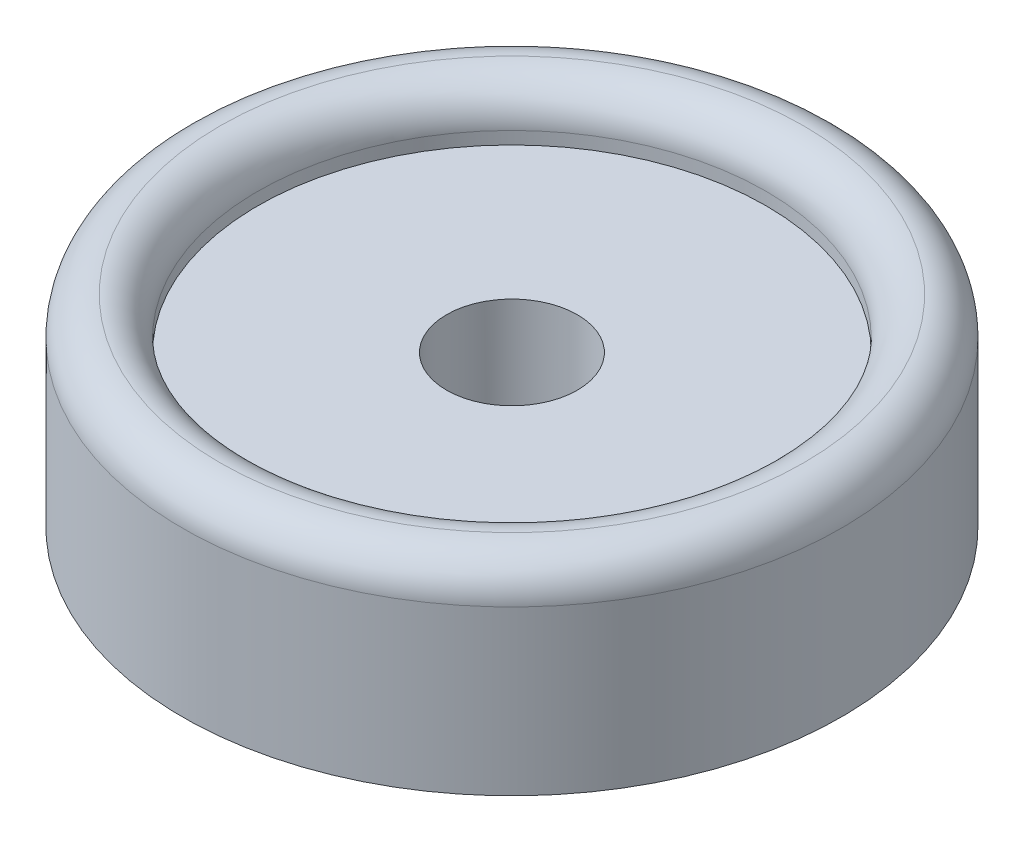
ISO-10303-21;
HEADER;
FILE_DESCRIPTION(('STEP AP214'),'2;1');
FILE_NAME('part.step','',(''),(''),'','','');
FILE_SCHEMA(('AUTOMOTIVE_DESIGN { 1 0 10303 214 1 1 1 1 }'));
ENDSEC;
DATA;
#1=APPLICATION_CONTEXT('core data for automotive mechanical design processes');
#2=APPLICATION_PROTOCOL_DEFINITION('international standard','automotive_design',2000,#1);
#3=PRODUCT_CONTEXT('',#1,'mechanical');
#4=PRODUCT('Part','Part','',(#3));
#5=PRODUCT_RELATED_PRODUCT_CATEGORY('part','',(#4));
#6=PRODUCT_DEFINITION_FORMATION('','',#4);
#7=PRODUCT_DEFINITION_CONTEXT('part definition',#1,'design');
#8=PRODUCT_DEFINITION('design','',#6,#7);
#9=PRODUCT_DEFINITION_SHAPE('','',#8);
#10=(LENGTH_UNIT() NAMED_UNIT(*) SI_UNIT(.MILLI.,.METRE.));
#11=(NAMED_UNIT(*) PLANE_ANGLE_UNIT() SI_UNIT($,.RADIAN.));
#12=(NAMED_UNIT(*) SI_UNIT($,.STERADIAN.) SOLID_ANGLE_UNIT());
#13=UNCERTAINTY_MEASURE_WITH_UNIT(LENGTH_MEASURE(1.E-05),#10,'distance_accuracy_value','');
#14=(GEOMETRIC_REPRESENTATION_CONTEXT(3) GLOBAL_UNCERTAINTY_ASSIGNED_CONTEXT((#13)) GLOBAL_UNIT_ASSIGNED_CONTEXT((#10,
#11,#12)) REPRESENTATION_CONTEXT('',''));
#15=CARTESIAN_POINT('',(0.,0.,0.));
#16=DIRECTION('',(0.,0.,1.));
#17=DIRECTION('',(1.,0.,0.));
#18=AXIS2_PLACEMENT_3D('',#15,#16,#17);
#19=CARTESIAN_POINT('',(0.,-50.,0.));
#20=DIRECTION('',(0.,-1.,0.));
#21=DIRECTION('',(0.,0.,-1.));
#22=AXIS2_PLACEMENT_3D('',#19,#20,#21);
#23=PLANE('',#22);
#24=CARTESIAN_POINT('',(0.,-50.,0.));
#25=DIRECTION('',(0.,-1.,0.));
#26=DIRECTION('',(0.,0.,-1.));
#27=AXIS2_PLACEMENT_3D('',#24,#25,#26);
#28=CIRCLE('',#27,10.1);
#29=CARTESIAN_POINT('',(0.,-50.,-10.1));
#30=VERTEX_POINT('',#29);
#31=EDGE_CURVE('E59',#30,#30,#28,.T.);
#32=ORIENTED_EDGE('',*,*,#31,.F.);
#33=EDGE_LOOP('',(#32));
#34=FACE_BOUND('',#33,.T.);
#35=CARTESIAN_POINT('',(0.,-50.,0.));
#36=DIRECTION('',(0.,-1.,0.));
#37=DIRECTION('',(0.,0.,-1.));
#38=AXIS2_PLACEMENT_3D('',#35,#36,#37);
#39=CIRCLE('',#38,2.6);
#40=CARTESIAN_POINT('',(0.,-50.,-2.6));
#41=VERTEX_POINT('',#40);
#42=EDGE_CURVE('E65',#41,#41,#39,.T.);
#43=ORIENTED_EDGE('',*,*,#42,.T.);
#44=EDGE_LOOP('',(#43));
#45=FACE_BOUND('',#44,.T.);
#46=ADVANCED_FACE('F45',(#34,#45),#23,.F.);
#47=CARTESIAN_POINT('',(0.,-56.,0.));
#48=DIRECTION('',(0.,-1.,0.));
#49=DIRECTION('',(0.,0.,-1.));
#50=AXIS2_PLACEMENT_3D('',#47,#48,#49);
#51=PLANE('',#50);
#52=CARTESIAN_POINT('',(0.,-56.,0.));
#53=DIRECTION('',(0.,1.,0.));
#54=DIRECTION('',(0.,0.,1.));
#55=AXIS2_PLACEMENT_3D('',#52,#53,#54);
#56=CIRCLE('',#55,2.6);
#57=CARTESIAN_POINT('',(0.,-56.,2.6));
#58=VERTEX_POINT('',#57);
#59=EDGE_CURVE('E69',#58,#58,#56,.T.);
#60=ORIENTED_EDGE('',*,*,#59,.T.);
#61=EDGE_LOOP('',(#60));
#62=FACE_BOUND('',#61,.T.);
#63=CARTESIAN_POINT('',(0.,-56.,0.));
#64=DIRECTION('',(0.,-1.,0.));
#65=DIRECTION('',(0.,0.,-1.));
#66=AXIS2_PLACEMENT_3D('',#63,#64,#65);
#67=CIRCLE('',#66,13.1);
#68=CARTESIAN_POINT('',(0.,-56.,-13.1));
#69=VERTEX_POINT('',#68);
#70=EDGE_CURVE('E73',#69,#69,#67,.T.);
#71=ORIENTED_EDGE('',*,*,#70,.T.);
#72=EDGE_LOOP('',(#71));
#73=FACE_BOUND('',#72,.T.);
#74=ADVANCED_FACE('F96',(#62,#73),#51,.T.);
#75=CARTESIAN_POINT('',(0.,-56.,0.));
#76=DIRECTION('',(0.,1.,0.));
#77=DIRECTION('',(0.,0.,1.));
#78=AXIS2_PLACEMENT_3D('',#75,#76,#77);
#79=CYLINDRICAL_SURFACE('',#78,2.6);
#80=ORIENTED_EDGE('',*,*,#59,.F.);
#81=EDGE_LOOP('',(#80));
#82=FACE_BOUND('',#81,.T.);
#83=ORIENTED_EDGE('',*,*,#42,.F.);
#84=EDGE_LOOP('',(#83));
#85=FACE_BOUND('',#84,.T.);
#86=ADVANCED_FACE('F103',(#82,#85),#79,.F.);
#87=CARTESIAN_POINT('',(0.,-48.,0.));
#88=DIRECTION('',(0.,-1.,0.));
#89=DIRECTION('',(0.,0.,-1.));
#90=AXIS2_PLACEMENT_3D('',#87,#88,#89);
#91=CYLINDRICAL_SURFACE('',#90,10.1);
#92=CARTESIAN_POINT('',(0.,-49.5,0.));
#93=DIRECTION('',(0.,-1.,0.));
#94=DIRECTION('',(0.,0.,-1.));
#95=AXIS2_PLACEMENT_3D('',#92,#93,#94);
#96=CIRCLE('',#95,10.1);
#97=CARTESIAN_POINT('',(0.,-49.5,-10.1));
#98=VERTEX_POINT('',#97);
#99=EDGE_CURVE('E10',#98,#98,#96,.F.);
#100=ORIENTED_EDGE('',*,*,#99,.T.);
#101=EDGE_LOOP('',(#100));
#102=FACE_BOUND('',#101,.T.);
#103=ORIENTED_EDGE('',*,*,#31,.T.);
#104=EDGE_LOOP('',(#103));
#105=FACE_BOUND('',#104,.T.);
#106=ADVANCED_FACE('F92',(#102,#105),#91,.F.);
#107=CARTESIAN_POINT('',(0.,-48.,0.));
#108=DIRECTION('',(0.,-1.,0.));
#109=DIRECTION('',(0.,0.,-1.));
#110=AXIS2_PLACEMENT_3D('',#107,#108,#109);
#111=CYLINDRICAL_SURFACE('',#110,13.1);
#112=CARTESIAN_POINT('',(0.,-49.5,0.));
#113=DIRECTION('',(0.,-1.,0.));
#114=DIRECTION('',(0.,0.,-1.));
#115=AXIS2_PLACEMENT_3D('',#112,#113,#114);
#116=CIRCLE('',#115,13.1);
#117=CARTESIAN_POINT('',(0.,-49.5,-13.1));
#118=VERTEX_POINT('',#117);
#119=EDGE_CURVE('E54',#118,#118,#116,.T.);
#120=ORIENTED_EDGE('',*,*,#119,.T.);
#121=EDGE_LOOP('',(#120));
#122=FACE_BOUND('',#121,.T.);
#123=ORIENTED_EDGE('',*,*,#70,.F.);
#124=EDGE_LOOP('',(#123));
#125=FACE_BOUND('',#124,.T.);
#126=ADVANCED_FACE('F86',(#122,#125),#111,.T.);
#127=CARTESIAN_POINT('',(0.,-49.5,0.));
#128=DIRECTION('',(0.,-1.,0.));
#129=DIRECTION('',(0.,0.,-1.));
#130=AXIS2_PLACEMENT_3D('',#127,#128,#129);
#131=TOROIDAL_SURFACE('',#130,11.6,1.5);
#132=ORIENTED_EDGE('',*,*,#99,.F.);
#133=EDGE_LOOP('',(#132));
#134=FACE_BOUND('',#133,.T.);
#135=CARTESIAN_POINT('',(0.,-48.,0.));
#136=DIRECTION('',(0.,-1.,0.));
#137=DIRECTION('',(0.,0.,-1.));
#138=AXIS2_PLACEMENT_3D('',#135,#136,#137);
#139=CIRCLE('',#138,11.6);
#140=CARTESIAN_POINT('',(0.,-48.,-11.6));
#141=VERTEX_POINT('',#140);
#142=EDGE_CURVE('E49',#141,#141,#139,.T.);
#143=ORIENTED_EDGE('',*,*,#142,.F.);
#144=EDGE_LOOP('',(#143));
#145=FACE_BOUND('',#144,.T.);
#146=ADVANCED_FACE('F47',(#134,#145),#131,.T.);
#147=CARTESIAN_POINT('',(0.,-49.5,0.));
#148=DIRECTION('',(0.,-1.,0.));
#149=DIRECTION('',(0.,0.,-1.));
#150=AXIS2_PLACEMENT_3D('',#147,#148,#149);
#151=TOROIDAL_SURFACE('',#150,11.6,1.5);
#152=ORIENTED_EDGE('',*,*,#142,.T.);
#153=EDGE_LOOP('',(#152));
#154=FACE_BOUND('',#153,.T.);
#155=ORIENTED_EDGE('',*,*,#119,.F.);
#156=EDGE_LOOP('',(#155));
#157=FACE_BOUND('',#156,.T.);
#158=ADVANCED_FACE('F82',(#154,#157),#151,.T.);
#159=CLOSED_SHELL('',(#46,#74,#86,#106,#126,#146,#158));
#160=MANIFOLD_SOLID_BREP('B2',#159);
#161=ADVANCED_BREP_SHAPE_REPRESENTATION('',(#18,#160),#14);
#162=SHAPE_DEFINITION_REPRESENTATION(#9,#161);
ENDSEC;
END-ISO-10303-21;
